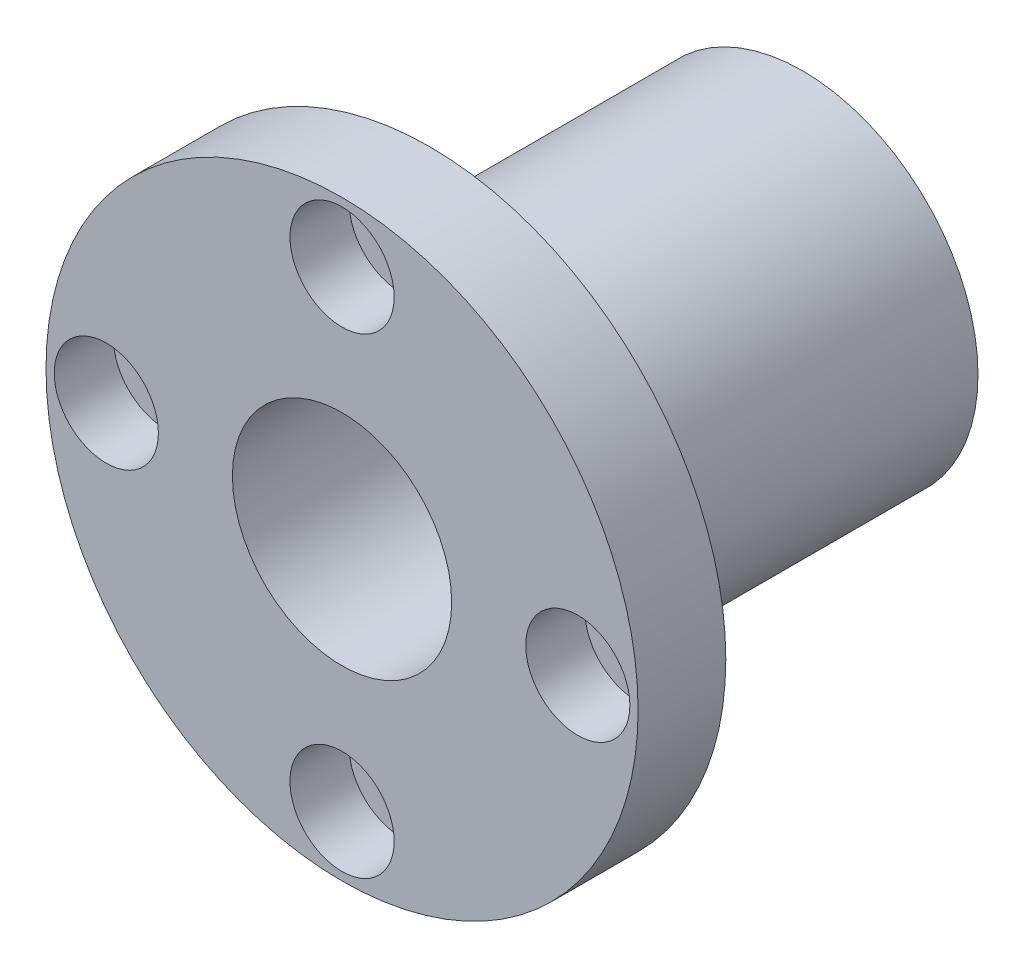
ISO-10303-21;
HEADER;
FILE_DESCRIPTION(('STEP AP214'),'2;1');
FILE_NAME('part.step','',(''),(''),'','','');
FILE_SCHEMA(('AUTOMOTIVE_DESIGN { 1 0 10303 214 1 1 1 1 }'));
ENDSEC;
DATA;
#1=APPLICATION_CONTEXT('core data for automotive mechanical design processes');
#2=APPLICATION_PROTOCOL_DEFINITION('international standard','automotive_design',2000,#1);
#3=PRODUCT_CONTEXT('',#1,'mechanical');
#4=PRODUCT('Part','Part','',(#3));
#5=PRODUCT_RELATED_PRODUCT_CATEGORY('part','',(#4));
#6=PRODUCT_DEFINITION_FORMATION('','',#4);
#7=PRODUCT_DEFINITION_CONTEXT('part definition',#1,'design');
#8=PRODUCT_DEFINITION('design','',#6,#7);
#9=PRODUCT_DEFINITION_SHAPE('','',#8);
#10=(LENGTH_UNIT() NAMED_UNIT(*) SI_UNIT(.MILLI.,.METRE.));
#11=(NAMED_UNIT(*) PLANE_ANGLE_UNIT() SI_UNIT($,.RADIAN.));
#12=(NAMED_UNIT(*) SI_UNIT($,.STERADIAN.) SOLID_ANGLE_UNIT());
#13=UNCERTAINTY_MEASURE_WITH_UNIT(LENGTH_MEASURE(1.E-05),#10,'distance_accuracy_value','');
#14=(GEOMETRIC_REPRESENTATION_CONTEXT(3) GLOBAL_UNCERTAINTY_ASSIGNED_CONTEXT((#13)) GLOBAL_UNIT_ASSIGNED_CONTEXT((#10,
#11,#12)) REPRESENTATION_CONTEXT('',''));
#15=CARTESIAN_POINT('',(0.,0.,0.));
#16=DIRECTION('',(0.,0.,1.));
#17=DIRECTION('',(1.,0.,0.));
#18=AXIS2_PLACEMENT_3D('',#15,#16,#17);
#19=CARTESIAN_POINT('',(-10.,0.,42.));
#20=DIRECTION('',(0.,0.,-1.));
#21=DIRECTION('',(-1.,0.,0.));
#22=AXIS2_PLACEMENT_3D('',#19,#20,#21);
#23=PLANE('',#22);
#24=CARTESIAN_POINT('',(-21.5,0.,42.));
#25=DIRECTION('',(0.,0.,1.));
#26=DIRECTION('',(1.,0.,0.));
#27=AXIS2_PLACEMENT_3D('',#24,#25,#26);
#28=CIRCLE('',#27,4.75000000000001);
#29=CARTESIAN_POINT('',(-16.75,0.,42.));
#30=VERTEX_POINT('',#29);
#31=EDGE_CURVE('E92',#30,#30,#28,.T.);
#32=ORIENTED_EDGE('',*,*,#31,.F.);
#33=EDGE_LOOP('',(#32));
#34=FACE_BOUND('',#33,.T.);
#35=CARTESIAN_POINT('',(0.,21.5,42.));
#36=DIRECTION('',(0.,0.,1.));
#37=DIRECTION('',(1.,0.,0.));
#38=AXIS2_PLACEMENT_3D('',#35,#36,#37);
#39=CIRCLE('',#38,4.75000000000001);
#40=CARTESIAN_POINT('',(4.75000000000001,21.5,42.));
#41=VERTEX_POINT('',#40);
#42=EDGE_CURVE('E80',#41,#41,#39,.T.);
#43=ORIENTED_EDGE('',*,*,#42,.F.);
#44=EDGE_LOOP('',(#43));
#45=FACE_BOUND('',#44,.T.);
#46=CARTESIAN_POINT('',(0.,0.,42.));
#47=DIRECTION('',(0.,0.,-1.));
#48=DIRECTION('',(-1.,0.,0.));
#49=AXIS2_PLACEMENT_3D('',#46,#47,#48);
#50=CIRCLE('',#49,10.);
#51=CARTESIAN_POINT('',(-10.,0.,42.));
#52=VERTEX_POINT('',#51);
#53=EDGE_CURVE('E53',#52,#52,#50,.T.);
#54=ORIENTED_EDGE('',*,*,#53,.T.);
#55=EDGE_LOOP('',(#54));
#56=FACE_BOUND('',#55,.T.);
#57=CARTESIAN_POINT('',(0.,0.,42.));
#58=DIRECTION('',(0.,0.,-1.));
#59=DIRECTION('',(-1.,0.,0.));
#60=AXIS2_PLACEMENT_3D('',#57,#58,#59);
#61=CIRCLE('',#60,27.);
#62=CARTESIAN_POINT('',(-27.,0.,42.));
#63=VERTEX_POINT('',#62);
#64=EDGE_CURVE('E56',#63,#63,#61,.T.);
#65=ORIENTED_EDGE('',*,*,#64,.F.);
#66=EDGE_LOOP('',(#65));
#67=FACE_BOUND('',#66,.T.);
#68=CARTESIAN_POINT('',(21.5,0.,42.));
#69=DIRECTION('',(0.,0.,1.));
#70=DIRECTION('',(1.,0.,0.));
#71=AXIS2_PLACEMENT_3D('',#68,#69,#70);
#72=CIRCLE('',#71,4.75000000000001);
#73=CARTESIAN_POINT('',(26.25,0.,42.));
#74=VERTEX_POINT('',#73);
#75=EDGE_CURVE('E68',#74,#74,#72,.T.);
#76=ORIENTED_EDGE('',*,*,#75,.F.);
#77=EDGE_LOOP('',(#76));
#78=FACE_BOUND('',#77,.T.);
#79=CARTESIAN_POINT('',(0.,-21.5,42.));
#80=DIRECTION('',(0.,0.,1.));
#81=DIRECTION('',(1.,0.,0.));
#82=AXIS2_PLACEMENT_3D('',#79,#80,#81);
#83=CIRCLE('',#82,4.75000000000001);
#84=CARTESIAN_POINT('',(4.75000000000001,-21.5,42.));
#85=VERTEX_POINT('',#84);
#86=EDGE_CURVE('E104',#85,#85,#83,.T.);
#87=ORIENTED_EDGE('',*,*,#86,.F.);
#88=EDGE_LOOP('',(#87));
#89=FACE_BOUND('',#88,.T.);
#90=ADVANCED_FACE('F33',(#34,#45,#56,#67,#78,#89),#23,.F.);
#91=CARTESIAN_POINT('',(0.,0.,0.));
#92=DIRECTION('',(0.,0.,-1.));
#93=DIRECTION('',(-1.,0.,0.));
#94=AXIS2_PLACEMENT_3D('',#91,#92,#93);
#95=CYLINDRICAL_SURFACE('',#94,27.);
#96=CARTESIAN_POINT('',(0.,0.,34.));
#97=DIRECTION('',(0.,0.,-1.));
#98=DIRECTION('',(-1.,0.,0.));
#99=AXIS2_PLACEMENT_3D('',#96,#97,#98);
#100=CIRCLE('',#99,27.);
#101=CARTESIAN_POINT('',(-27.,0.,34.));
#102=VERTEX_POINT('',#101);
#103=EDGE_CURVE('E10',#102,#102,#100,.T.);
#104=ORIENTED_EDGE('',*,*,#103,.F.);
#105=EDGE_LOOP('',(#104));
#106=FACE_BOUND('',#105,.T.);
#107=ORIENTED_EDGE('',*,*,#64,.T.);
#108=EDGE_LOOP('',(#107));
#109=FACE_BOUND('',#108,.T.);
#110=ADVANCED_FACE('F35',(#106,#109),#95,.T.);
#111=CARTESIAN_POINT('',(-16.,0.,34.));
#112=DIRECTION('',(0.,0.,1.));
#113=DIRECTION('',(1.,0.,0.));
#114=AXIS2_PLACEMENT_3D('',#111,#112,#113);
#115=PLANE('',#114);
#116=CARTESIAN_POINT('',(0.,-21.5,34.));
#117=DIRECTION('',(0.,0.,1.));
#118=DIRECTION('',(1.,0.,0.));
#119=AXIS2_PLACEMENT_3D('',#116,#117,#118);
#120=CIRCLE('',#119,2.75000000000001);
#121=CARTESIAN_POINT('',(2.75000000000001,-21.5,34.));
#122=VERTEX_POINT('',#121);
#123=EDGE_CURVE('E95',#122,#122,#120,.T.);
#124=ORIENTED_EDGE('',*,*,#123,.T.);
#125=EDGE_LOOP('',(#124));
#126=FACE_BOUND('',#125,.T.);
#127=CARTESIAN_POINT('',(-21.5,0.,34.));
#128=DIRECTION('',(0.,0.,1.));
#129=DIRECTION('',(1.,0.,0.));
#130=AXIS2_PLACEMENT_3D('',#127,#128,#129);
#131=CIRCLE('',#130,2.75000000000001);
#132=CARTESIAN_POINT('',(-18.75,0.,34.));
#133=VERTEX_POINT('',#132);
#134=EDGE_CURVE('E83',#133,#133,#131,.T.);
#135=ORIENTED_EDGE('',*,*,#134,.T.);
#136=EDGE_LOOP('',(#135));
#137=FACE_BOUND('',#136,.T.);
#138=CARTESIAN_POINT('',(0.,21.5,34.));
#139=DIRECTION('',(0.,0.,1.));
#140=DIRECTION('',(1.,0.,0.));
#141=AXIS2_PLACEMENT_3D('',#138,#139,#140);
#142=CIRCLE('',#141,2.75000000000001);
#143=CARTESIAN_POINT('',(2.75000000000001,21.5,34.));
#144=VERTEX_POINT('',#143);
#145=EDGE_CURVE('E71',#144,#144,#142,.T.);
#146=ORIENTED_EDGE('',*,*,#145,.T.);
#147=EDGE_LOOP('',(#146));
#148=FACE_BOUND('',#147,.T.);
#149=CARTESIAN_POINT('',(21.5,0.,34.));
#150=DIRECTION('',(0.,0.,1.));
#151=DIRECTION('',(1.,0.,0.));
#152=AXIS2_PLACEMENT_3D('',#149,#150,#151);
#153=CIRCLE('',#152,2.75000000000001);
#154=CARTESIAN_POINT('',(24.25,0.,34.));
#155=VERTEX_POINT('',#154);
#156=EDGE_CURVE('E59',#155,#155,#153,.T.);
#157=ORIENTED_EDGE('',*,*,#156,.T.);
#158=EDGE_LOOP('',(#157));
#159=FACE_BOUND('',#158,.T.);
#160=CARTESIAN_POINT('',(0.,0.,34.));
#161=DIRECTION('',(0.,0.,-1.));
#162=DIRECTION('',(-1.,0.,0.));
#163=AXIS2_PLACEMENT_3D('',#160,#161,#162);
#164=CIRCLE('',#163,16.);
#165=CARTESIAN_POINT('',(-16.,0.,34.));
#166=VERTEX_POINT('',#165);
#167=EDGE_CURVE('E40',#166,#166,#164,.T.);
#168=ORIENTED_EDGE('',*,*,#167,.F.);
#169=EDGE_LOOP('',(#168));
#170=FACE_BOUND('',#169,.T.);
#171=ORIENTED_EDGE('',*,*,#103,.T.);
#172=EDGE_LOOP('',(#171));
#173=FACE_BOUND('',#172,.T.);
#174=ADVANCED_FACE('F116',(#126,#137,#148,#159,#170,#173),#115,.F.);
#175=CARTESIAN_POINT('',(0.,0.,0.));
#176=DIRECTION('',(0.,0.,-1.));
#177=DIRECTION('',(-1.,0.,0.));
#178=AXIS2_PLACEMENT_3D('',#175,#176,#177);
#179=CYLINDRICAL_SURFACE('',#178,16.);
#180=CARTESIAN_POINT('',(0.,0.,0.));
#181=DIRECTION('',(0.,0.,-1.));
#182=DIRECTION('',(-1.,0.,0.));
#183=AXIS2_PLACEMENT_3D('',#180,#181,#182);
#184=CIRCLE('',#183,16.);
#185=CARTESIAN_POINT('',(-16.,0.,0.));
#186=VERTEX_POINT('',#185);
#187=EDGE_CURVE('E44',#186,#186,#184,.T.);
#188=ORIENTED_EDGE('',*,*,#187,.F.);
#189=EDGE_LOOP('',(#188));
#190=FACE_BOUND('',#189,.T.);
#191=ORIENTED_EDGE('',*,*,#167,.T.);
#192=EDGE_LOOP('',(#191));
#193=FACE_BOUND('',#192,.T.);
#194=ADVANCED_FACE('F131',(#190,#193),#179,.T.);
#195=CARTESIAN_POINT('',(-16.,0.,0.));
#196=DIRECTION('',(0.,0.,1.));
#197=DIRECTION('',(1.,0.,0.));
#198=AXIS2_PLACEMENT_3D('',#195,#196,#197);
#199=PLANE('',#198);
#200=CARTESIAN_POINT('',(0.,0.,0.));
#201=DIRECTION('',(0.,0.,-1.));
#202=DIRECTION('',(-1.,0.,0.));
#203=AXIS2_PLACEMENT_3D('',#200,#201,#202);
#204=CIRCLE('',#203,10.);
#205=CARTESIAN_POINT('',(-10.,0.,0.));
#206=VERTEX_POINT('',#205);
#207=EDGE_CURVE('E48',#206,#206,#204,.T.);
#208=ORIENTED_EDGE('',*,*,#207,.F.);
#209=EDGE_LOOP('',(#208));
#210=FACE_BOUND('',#209,.T.);
#211=ORIENTED_EDGE('',*,*,#187,.T.);
#212=EDGE_LOOP('',(#211));
#213=FACE_BOUND('',#212,.T.);
#214=ADVANCED_FACE('F127',(#210,#213),#199,.F.);
#215=CARTESIAN_POINT('',(0.,0.,0.));
#216=DIRECTION('',(0.,0.,-1.));
#217=DIRECTION('',(-1.,0.,0.));
#218=AXIS2_PLACEMENT_3D('',#215,#216,#217);
#219=CYLINDRICAL_SURFACE('',#218,10.);
#220=ORIENTED_EDGE('',*,*,#53,.F.);
#221=EDGE_LOOP('',(#220));
#222=FACE_BOUND('',#221,.T.);
#223=ORIENTED_EDGE('',*,*,#207,.T.);
#224=EDGE_LOOP('',(#223));
#225=FACE_BOUND('',#224,.T.);
#226=ADVANCED_FACE('F124',(#222,#225),#219,.F.);
#227=CARTESIAN_POINT('',(21.5,0.,42.));
#228=DIRECTION('',(0.,0.,1.));
#229=DIRECTION('',(1.,0.,0.));
#230=AXIS2_PLACEMENT_3D('',#227,#228,#229);
#231=CYLINDRICAL_SURFACE('',#230,2.75000000000001);
#232=ORIENTED_EDGE('',*,*,#156,.F.);
#233=EDGE_LOOP('',(#232));
#234=FACE_BOUND('',#233,.T.);
#235=CARTESIAN_POINT('',(21.5,0.,36.6));
#236=DIRECTION('',(0.,0.,1.));
#237=DIRECTION('',(1.,0.,0.));
#238=AXIS2_PLACEMENT_3D('',#235,#236,#237);
#239=CIRCLE('',#238,2.75000000000001);
#240=CARTESIAN_POINT('',(24.25,0.,36.6));
#241=VERTEX_POINT('',#240);
#242=EDGE_CURVE('E62',#241,#241,#239,.T.);
#243=ORIENTED_EDGE('',*,*,#242,.T.);
#244=EDGE_LOOP('',(#243));
#245=FACE_BOUND('',#244,.T.);
#246=ADVANCED_FACE('F122',(#234,#245),#231,.F.);
#247=CARTESIAN_POINT('',(24.25,0.,36.6));
#248=DIRECTION('',(0.,0.,-1.));
#249=DIRECTION('',(-1.,0.,0.));
#250=AXIS2_PLACEMENT_3D('',#247,#248,#249);
#251=PLANE('',#250);
#252=ORIENTED_EDGE('',*,*,#242,.F.);
#253=EDGE_LOOP('',(#252));
#254=FACE_BOUND('',#253,.T.);
#255=CARTESIAN_POINT('',(21.5,0.,36.6));
#256=DIRECTION('',(0.,0.,1.));
#257=DIRECTION('',(1.,0.,0.));
#258=AXIS2_PLACEMENT_3D('',#255,#256,#257);
#259=CIRCLE('',#258,4.75000000000001);
#260=CARTESIAN_POINT('',(26.25,0.,36.6));
#261=VERTEX_POINT('',#260);
#262=EDGE_CURVE('E65',#261,#261,#259,.T.);
#263=ORIENTED_EDGE('',*,*,#262,.T.);
#264=EDGE_LOOP('',(#263));
#265=FACE_BOUND('',#264,.T.);
#266=ADVANCED_FACE('F150',(#254,#265),#251,.F.);
#267=CARTESIAN_POINT('',(21.5,0.,42.));
#268=DIRECTION('',(0.,0.,1.));
#269=DIRECTION('',(1.,0.,0.));
#270=AXIS2_PLACEMENT_3D('',#267,#268,#269);
#271=CYLINDRICAL_SURFACE('',#270,4.75000000000001);
#272=ORIENTED_EDGE('',*,*,#262,.F.);
#273=EDGE_LOOP('',(#272));
#274=FACE_BOUND('',#273,.T.);
#275=ORIENTED_EDGE('',*,*,#75,.T.);
#276=EDGE_LOOP('',(#275));
#277=FACE_BOUND('',#276,.T.);
#278=ADVANCED_FACE('F155',(#274,#277),#271,.F.);
#279=CARTESIAN_POINT('',(0.,21.5,42.));
#280=DIRECTION('',(0.,0.,1.));
#281=DIRECTION('',(1.,0.,0.));
#282=AXIS2_PLACEMENT_3D('',#279,#280,#281);
#283=CYLINDRICAL_SURFACE('',#282,2.75000000000001);
#284=ORIENTED_EDGE('',*,*,#145,.F.);
#285=EDGE_LOOP('',(#284));
#286=FACE_BOUND('',#285,.T.);
#287=CARTESIAN_POINT('',(0.,21.5,36.6));
#288=DIRECTION('',(0.,0.,1.));
#289=DIRECTION('',(1.,0.,0.));
#290=AXIS2_PLACEMENT_3D('',#287,#288,#289);
#291=CIRCLE('',#290,2.75000000000001);
#292=CARTESIAN_POINT('',(2.75000000000001,21.5,36.6));
#293=VERTEX_POINT('',#292);
#294=EDGE_CURVE('E74',#293,#293,#291,.T.);
#295=ORIENTED_EDGE('',*,*,#294,.T.);
#296=EDGE_LOOP('',(#295));
#297=FACE_BOUND('',#296,.T.);
#298=ADVANCED_FACE('F160',(#286,#297),#283,.F.);
#299=CARTESIAN_POINT('',(2.75000000000001,21.5,36.6));
#300=DIRECTION('',(0.,0.,-1.));
#301=DIRECTION('',(-1.,0.,0.));
#302=AXIS2_PLACEMENT_3D('',#299,#300,#301);
#303=PLANE('',#302);
#304=ORIENTED_EDGE('',*,*,#294,.F.);
#305=EDGE_LOOP('',(#304));
#306=FACE_BOUND('',#305,.T.);
#307=CARTESIAN_POINT('',(0.,21.5,36.6));
#308=DIRECTION('',(0.,0.,1.));
#309=DIRECTION('',(1.,0.,0.));
#310=AXIS2_PLACEMENT_3D('',#307,#308,#309);
#311=CIRCLE('',#310,4.75000000000001);
#312=CARTESIAN_POINT('',(4.75000000000001,21.5,36.6));
#313=VERTEX_POINT('',#312);
#314=EDGE_CURVE('E77',#313,#313,#311,.T.);
#315=ORIENTED_EDGE('',*,*,#314,.T.);
#316=EDGE_LOOP('',(#315));
#317=FACE_BOUND('',#316,.T.);
#318=ADVANCED_FACE('F167',(#306,#317),#303,.F.);
#319=CARTESIAN_POINT('',(0.,21.5,42.));
#320=DIRECTION('',(0.,0.,1.));
#321=DIRECTION('',(1.,0.,0.));
#322=AXIS2_PLACEMENT_3D('',#319,#320,#321);
#323=CYLINDRICAL_SURFACE('',#322,4.75000000000001);
#324=ORIENTED_EDGE('',*,*,#314,.F.);
#325=EDGE_LOOP('',(#324));
#326=FACE_BOUND('',#325,.T.);
#327=ORIENTED_EDGE('',*,*,#42,.T.);
#328=EDGE_LOOP('',(#327));
#329=FACE_BOUND('',#328,.T.);
#330=ADVANCED_FACE('F173',(#326,#329),#323,.F.);
#331=CARTESIAN_POINT('',(-21.5,0.,42.));
#332=DIRECTION('',(0.,0.,1.));
#333=DIRECTION('',(1.,0.,0.));
#334=AXIS2_PLACEMENT_3D('',#331,#332,#333);
#335=CYLINDRICAL_SURFACE('',#334,2.75000000000001);
#336=ORIENTED_EDGE('',*,*,#134,.F.);
#337=EDGE_LOOP('',(#336));
#338=FACE_BOUND('',#337,.T.);
#339=CARTESIAN_POINT('',(-21.5,0.,36.6));
#340=DIRECTION('',(0.,0.,1.));
#341=DIRECTION('',(1.,0.,0.));
#342=AXIS2_PLACEMENT_3D('',#339,#340,#341);
#343=CIRCLE('',#342,2.75000000000001);
#344=CARTESIAN_POINT('',(-18.75,0.,36.6));
#345=VERTEX_POINT('',#344);
#346=EDGE_CURVE('E86',#345,#345,#343,.T.);
#347=ORIENTED_EDGE('',*,*,#346,.T.);
#348=EDGE_LOOP('',(#347));
#349=FACE_BOUND('',#348,.T.);
#350=ADVANCED_FACE('F177',(#338,#349),#335,.F.);
#351=CARTESIAN_POINT('',(-18.75,0.,36.6));
#352=DIRECTION('',(0.,0.,-1.));
#353=DIRECTION('',(-1.,0.,0.));
#354=AXIS2_PLACEMENT_3D('',#351,#352,#353);
#355=PLANE('',#354);
#356=ORIENTED_EDGE('',*,*,#346,.F.);
#357=EDGE_LOOP('',(#356));
#358=FACE_BOUND('',#357,.T.);
#359=CARTESIAN_POINT('',(-21.5,0.,36.6));
#360=DIRECTION('',(0.,0.,1.));
#361=DIRECTION('',(1.,0.,0.));
#362=AXIS2_PLACEMENT_3D('',#359,#360,#361);
#363=CIRCLE('',#362,4.75000000000001);
#364=CARTESIAN_POINT('',(-16.75,0.,36.6));
#365=VERTEX_POINT('',#364);
#366=EDGE_CURVE('E89',#365,#365,#363,.T.);
#367=ORIENTED_EDGE('',*,*,#366,.T.);
#368=EDGE_LOOP('',(#367));
#369=FACE_BOUND('',#368,.T.);
#370=ADVANCED_FACE('F181',(#358,#369),#355,.F.);
#371=CARTESIAN_POINT('',(-21.5,0.,42.));
#372=DIRECTION('',(0.,0.,1.));
#373=DIRECTION('',(1.,0.,0.));
#374=AXIS2_PLACEMENT_3D('',#371,#372,#373);
#375=CYLINDRICAL_SURFACE('',#374,4.75000000000001);
#376=ORIENTED_EDGE('',*,*,#366,.F.);
#377=EDGE_LOOP('',(#376));
#378=FACE_BOUND('',#377,.T.);
#379=ORIENTED_EDGE('',*,*,#31,.T.);
#380=EDGE_LOOP('',(#379));
#381=FACE_BOUND('',#380,.T.);
#382=ADVANCED_FACE('F185',(#378,#381),#375,.F.);
#383=CARTESIAN_POINT('',(0.,-21.5,42.));
#384=DIRECTION('',(0.,0.,1.));
#385=DIRECTION('',(1.,0.,0.));
#386=AXIS2_PLACEMENT_3D('',#383,#384,#385);
#387=CYLINDRICAL_SURFACE('',#386,2.75000000000001);
#388=ORIENTED_EDGE('',*,*,#123,.F.);
#389=EDGE_LOOP('',(#388));
#390=FACE_BOUND('',#389,.T.);
#391=CARTESIAN_POINT('',(0.,-21.5,36.6));
#392=DIRECTION('',(0.,0.,1.));
#393=DIRECTION('',(1.,0.,0.));
#394=AXIS2_PLACEMENT_3D('',#391,#392,#393);
#395=CIRCLE('',#394,2.75000000000001);
#396=CARTESIAN_POINT('',(2.75000000000001,-21.5,36.6));
#397=VERTEX_POINT('',#396);
#398=EDGE_CURVE('E98',#397,#397,#395,.T.);
#399=ORIENTED_EDGE('',*,*,#398,.T.);
#400=EDGE_LOOP('',(#399));
#401=FACE_BOUND('',#400,.T.);
#402=ADVANCED_FACE('F189',(#390,#401),#387,.F.);
#403=CARTESIAN_POINT('',(2.75000000000001,-21.5,36.6));
#404=DIRECTION('',(0.,0.,-1.));
#405=DIRECTION('',(-1.,0.,0.));
#406=AXIS2_PLACEMENT_3D('',#403,#404,#405);
#407=PLANE('',#406);
#408=ORIENTED_EDGE('',*,*,#398,.F.);
#409=EDGE_LOOP('',(#408));
#410=FACE_BOUND('',#409,.T.);
#411=CARTESIAN_POINT('',(0.,-21.5,36.6));
#412=DIRECTION('',(0.,0.,1.));
#413=DIRECTION('',(1.,0.,0.));
#414=AXIS2_PLACEMENT_3D('',#411,#412,#413);
#415=CIRCLE('',#414,4.75000000000001);
#416=CARTESIAN_POINT('',(4.75000000000001,-21.5,36.6));
#417=VERTEX_POINT('',#416);
#418=EDGE_CURVE('E101',#417,#417,#415,.T.);
#419=ORIENTED_EDGE('',*,*,#418,.T.);
#420=EDGE_LOOP('',(#419));
#421=FACE_BOUND('',#420,.T.);
#422=ADVANCED_FACE('F193',(#410,#421),#407,.F.);
#423=CARTESIAN_POINT('',(0.,-21.5,42.));
#424=DIRECTION('',(0.,0.,1.));
#425=DIRECTION('',(1.,0.,0.));
#426=AXIS2_PLACEMENT_3D('',#423,#424,#425);
#427=CYLINDRICAL_SURFACE('',#426,4.75000000000001);
#428=ORIENTED_EDGE('',*,*,#418,.F.);
#429=EDGE_LOOP('',(#428));
#430=FACE_BOUND('',#429,.T.);
#431=ORIENTED_EDGE('',*,*,#86,.T.);
#432=EDGE_LOOP('',(#431));
#433=FACE_BOUND('',#432,.T.);
#434=ADVANCED_FACE('F108',(#430,#433),#427,.F.);
#435=CLOSED_SHELL('',(#90,#110,#174,#194,#214,#226,#246,#266,#278,#298,#318,#330,#350,#370,#382,
#402,#422,#434));
#436=MANIFOLD_SOLID_BREP('B2',#435);
#437=ADVANCED_BREP_SHAPE_REPRESENTATION('',(#18,#436),#14);
#438=SHAPE_DEFINITION_REPRESENTATION(#9,#437);
ENDSEC;
END-ISO-10303-21;
